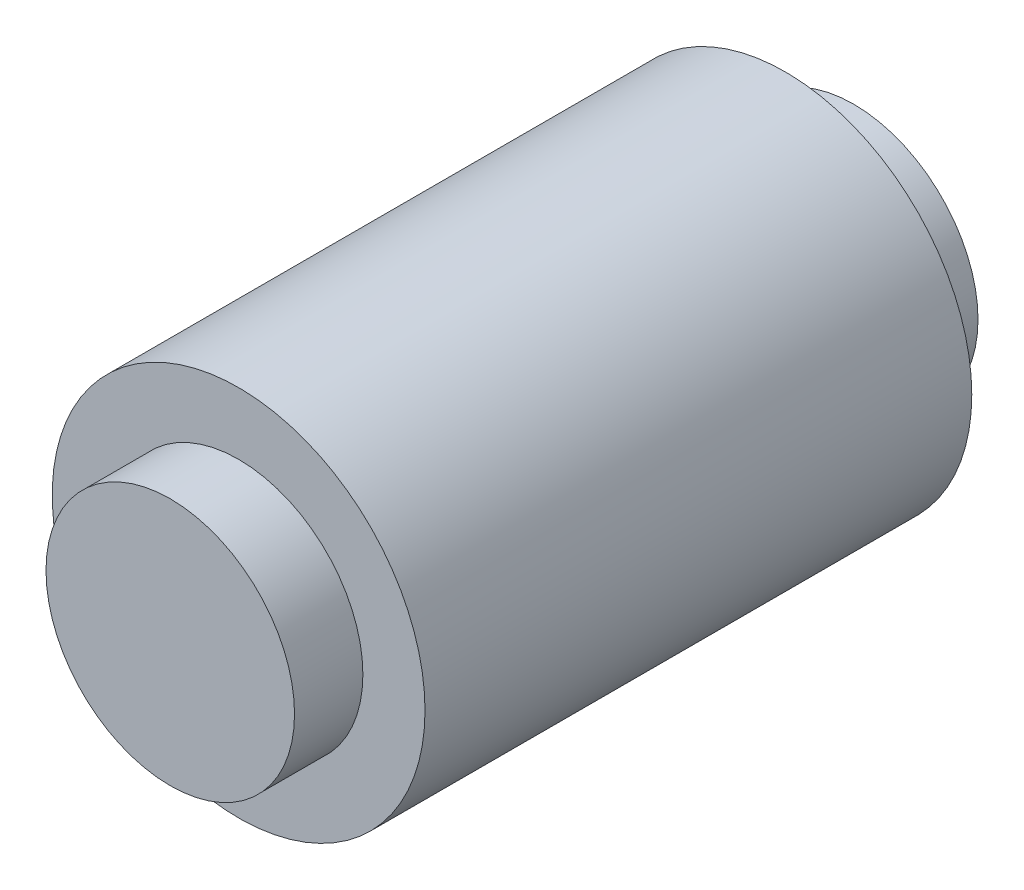
ISO-10303-21;
HEADER;
FILE_DESCRIPTION(('STEP AP214'),'2;1');
FILE_NAME('part.step','',(''),(''),'','','');
FILE_SCHEMA(('AUTOMOTIVE_DESIGN { 1 0 10303 214 1 1 1 1 }'));
ENDSEC;
DATA;
#1=APPLICATION_CONTEXT('core data for automotive mechanical design processes');
#2=APPLICATION_PROTOCOL_DEFINITION('international standard','automotive_design',2000,#1);
#3=PRODUCT_CONTEXT('',#1,'mechanical');
#4=PRODUCT('Part','Part','',(#3));
#5=PRODUCT_RELATED_PRODUCT_CATEGORY('part','',(#4));
#6=PRODUCT_DEFINITION_FORMATION('','',#4);
#7=PRODUCT_DEFINITION_CONTEXT('part definition',#1,'design');
#8=PRODUCT_DEFINITION('design','',#6,#7);
#9=PRODUCT_DEFINITION_SHAPE('','',#8);
#10=(LENGTH_UNIT() NAMED_UNIT(*) SI_UNIT(.MILLI.,.METRE.));
#11=(NAMED_UNIT(*) PLANE_ANGLE_UNIT() SI_UNIT($,.RADIAN.));
#12=(NAMED_UNIT(*) SI_UNIT($,.STERADIAN.) SOLID_ANGLE_UNIT());
#13=UNCERTAINTY_MEASURE_WITH_UNIT(LENGTH_MEASURE(1.E-05),#10,'distance_accuracy_value','');
#14=(GEOMETRIC_REPRESENTATION_CONTEXT(3) GLOBAL_UNCERTAINTY_ASSIGNED_CONTEXT((#13)) GLOBAL_UNIT_ASSIGNED_CONTEXT((#10,
#11,#12)) REPRESENTATION_CONTEXT('',''));
#15=CARTESIAN_POINT('',(0.,0.,0.));
#16=DIRECTION('',(0.,0.,1.));
#17=DIRECTION('',(1.,0.,0.));
#18=AXIS2_PLACEMENT_3D('',#15,#16,#17);
#19=CARTESIAN_POINT('',(0.,0.,44.));
#20=DIRECTION('',(0.,0.,-1.));
#21=DIRECTION('',(-1.,0.,0.));
#22=AXIS2_PLACEMENT_3D('',#19,#20,#21);
#23=CYLINDRICAL_SURFACE('',#22,15.);
#24=CARTESIAN_POINT('',(0.,0.,44.));
#25=DIRECTION('',(0.,0.,1.));
#26=DIRECTION('',(1.,0.,0.));
#27=AXIS2_PLACEMENT_3D('',#24,#25,#26);
#28=CIRCLE('',#27,15.);
#29=CARTESIAN_POINT('',(15.,0.,44.));
#30=VERTEX_POINT('',#29);
#31=EDGE_CURVE('E44',#30,#30,#28,.T.);
#32=ORIENTED_EDGE('',*,*,#31,.F.);
#33=EDGE_LOOP('',(#32));
#34=FACE_BOUND('',#33,.T.);
#35=CARTESIAN_POINT('',(0.,0.,0.));
#36=DIRECTION('',(0.,0.,1.));
#37=DIRECTION('',(1.,0.,0.));
#38=AXIS2_PLACEMENT_3D('',#35,#36,#37);
#39=CIRCLE('',#38,15.);
#40=CARTESIAN_POINT('',(15.,0.,0.));
#41=VERTEX_POINT('',#40);
#42=EDGE_CURVE('E35',#41,#41,#39,.T.);
#43=ORIENTED_EDGE('',*,*,#42,.T.);
#44=EDGE_LOOP('',(#43));
#45=FACE_BOUND('',#44,.T.);
#46=ADVANCED_FACE('F32',(#34,#45),#23,.T.);
#47=CARTESIAN_POINT('',(0.,0.,44.));
#48=DIRECTION('',(0.,0.,1.));
#49=DIRECTION('',(1.,0.,0.));
#50=AXIS2_PLACEMENT_3D('',#47,#48,#49);
#51=PLANE('',#50);
#52=CARTESIAN_POINT('',(0.,0.,44.));
#53=DIRECTION('',(0.,0.,1.));
#54=DIRECTION('',(1.,0.,0.));
#55=AXIS2_PLACEMENT_3D('',#52,#53,#54);
#56=CIRCLE('',#55,10.);
#57=CARTESIAN_POINT('',(10.,0.,44.));
#58=VERTEX_POINT('',#57);
#59=EDGE_CURVE('E39',#58,#58,#56,.T.);
#60=ORIENTED_EDGE('',*,*,#59,.F.);
#61=EDGE_LOOP('',(#60));
#62=FACE_BOUND('',#61,.T.);
#63=ORIENTED_EDGE('',*,*,#31,.T.);
#64=EDGE_LOOP('',(#63));
#65=FACE_BOUND('',#64,.T.);
#66=ADVANCED_FACE('F61',(#62,#65),#51,.T.);
#67=CARTESIAN_POINT('',(0.,0.,0.));
#68=DIRECTION('',(0.,0.,1.));
#69=DIRECTION('',(1.,0.,0.));
#70=AXIS2_PLACEMENT_3D('',#67,#68,#69);
#71=PLANE('',#70);
#72=CARTESIAN_POINT('',(0.,0.,0.));
#73=DIRECTION('',(0.,0.,-1.));
#74=DIRECTION('',(-1.,0.,0.));
#75=AXIS2_PLACEMENT_3D('',#72,#73,#74);
#76=CIRCLE('',#75,10.);
#77=CARTESIAN_POINT('',(-10.,0.,0.));
#78=VERTEX_POINT('',#77);
#79=EDGE_CURVE('E10',#78,#78,#76,.T.);
#80=ORIENTED_EDGE('',*,*,#79,.F.);
#81=EDGE_LOOP('',(#80));
#82=FACE_BOUND('',#81,.T.);
#83=ORIENTED_EDGE('',*,*,#42,.F.);
#84=EDGE_LOOP('',(#83));
#85=FACE_BOUND('',#84,.T.);
#86=ADVANCED_FACE('F58',(#82,#85),#71,.F.);
#87=CARTESIAN_POINT('',(0.,0.,49.5));
#88=DIRECTION('',(0.,0.,-1.));
#89=DIRECTION('',(-1.,0.,0.));
#90=AXIS2_PLACEMENT_3D('',#87,#88,#89);
#91=CYLINDRICAL_SURFACE('',#90,10.);
#92=CARTESIAN_POINT('',(0.,0.,49.5));
#93=DIRECTION('',(0.,0.,1.));
#94=DIRECTION('',(1.,0.,0.));
#95=AXIS2_PLACEMENT_3D('',#92,#93,#94);
#96=CIRCLE('',#95,10.);
#97=CARTESIAN_POINT('',(10.,0.,49.5));
#98=VERTEX_POINT('',#97);
#99=EDGE_CURVE('E49',#98,#98,#96,.T.);
#100=ORIENTED_EDGE('',*,*,#99,.F.);
#101=EDGE_LOOP('',(#100));
#102=FACE_BOUND('',#101,.T.);
#103=ORIENTED_EDGE('',*,*,#59,.T.);
#104=EDGE_LOOP('',(#103));
#105=FACE_BOUND('',#104,.T.);
#106=ADVANCED_FACE('F60',(#102,#105),#91,.T.);
#107=CARTESIAN_POINT('',(0.,0.,49.5));
#108=DIRECTION('',(0.,0.,1.));
#109=DIRECTION('',(1.,0.,0.));
#110=AXIS2_PLACEMENT_3D('',#107,#108,#109);
#111=PLANE('',#110);
#112=ORIENTED_EDGE('',*,*,#99,.T.);
#113=EDGE_LOOP('',(#112));
#114=FACE_BOUND('',#113,.T.);
#115=ADVANCED_FACE('F67',(#114),#111,.T.);
#116=CARTESIAN_POINT('',(0.,0.,-5.5));
#117=DIRECTION('',(0.,0.,1.));
#118=DIRECTION('',(1.,0.,0.));
#119=AXIS2_PLACEMENT_3D('',#116,#117,#118);
#120=CYLINDRICAL_SURFACE('',#119,10.);
#121=CARTESIAN_POINT('',(0.,0.,-5.5));
#122=DIRECTION('',(0.,0.,-1.));
#123=DIRECTION('',(-1.,0.,0.));
#124=AXIS2_PLACEMENT_3D('',#121,#122,#123);
#125=CIRCLE('',#124,10.);
#126=CARTESIAN_POINT('',(-10.,0.,-5.5));
#127=VERTEX_POINT('',#126);
#128=EDGE_CURVE('E48',#127,#127,#125,.T.);
#129=ORIENTED_EDGE('',*,*,#128,.F.);
#130=EDGE_LOOP('',(#129));
#131=FACE_BOUND('',#130,.T.);
#132=ORIENTED_EDGE('',*,*,#79,.T.);
#133=EDGE_LOOP('',(#132));
#134=FACE_BOUND('',#133,.T.);
#135=ADVANCED_FACE('F95',(#131,#134),#120,.T.);
#136=CARTESIAN_POINT('',(0.,0.,-5.5));
#137=DIRECTION('',(0.,0.,-1.));
#138=DIRECTION('',(-1.,0.,0.));
#139=AXIS2_PLACEMENT_3D('',#136,#137,#138);
#140=PLANE('',#139);
#141=ORIENTED_EDGE('',*,*,#128,.T.);
#142=EDGE_LOOP('',(#141));
#143=FACE_BOUND('',#142,.T.);
#144=ADVANCED_FACE('F109',(#143),#140,.T.);
#145=CLOSED_SHELL('',(#46,#66,#86,#106,#115,#135,#144));
#146=MANIFOLD_SOLID_BREP('B2',#145);
#147=ADVANCED_BREP_SHAPE_REPRESENTATION('',(#18,#146),#14);
#148=SHAPE_DEFINITION_REPRESENTATION(#9,#147);
ENDSEC;
END-ISO-10303-21;
